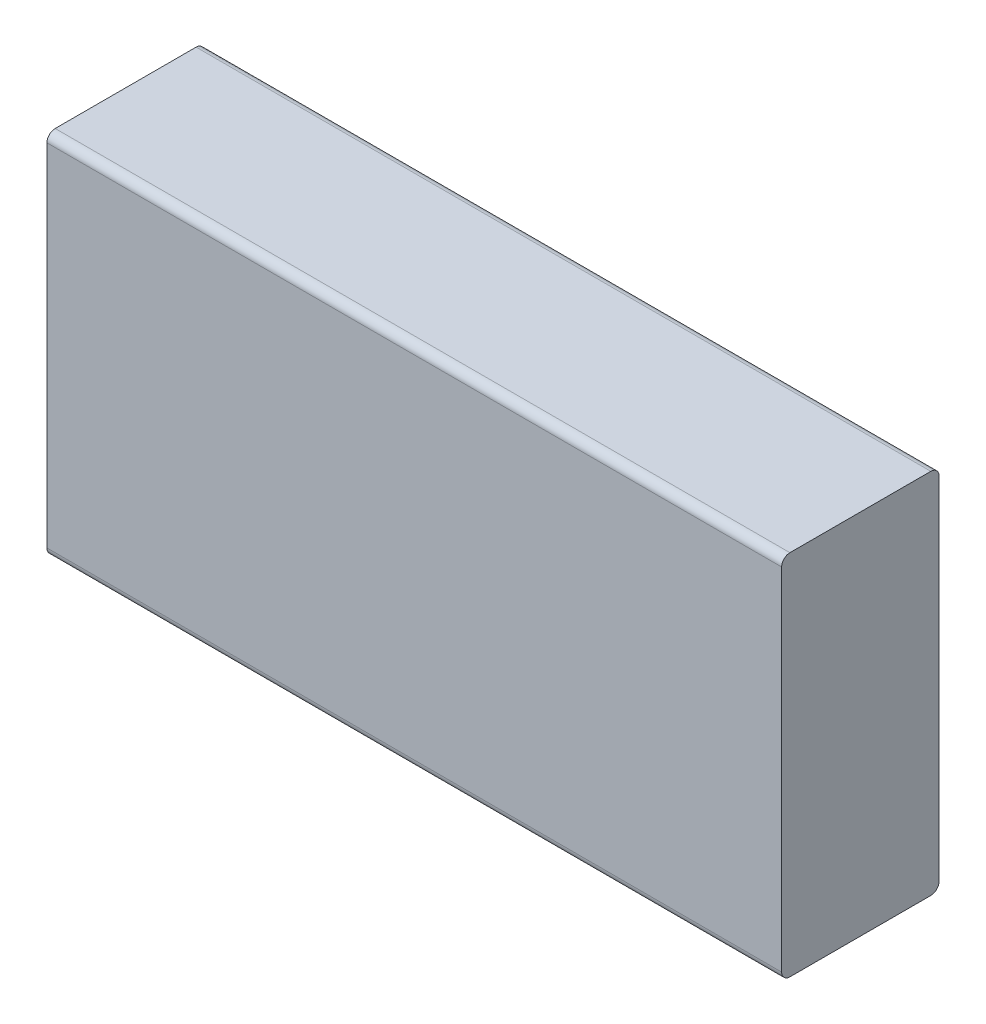
ISO-10303-21;
HEADER;
FILE_DESCRIPTION(('STEP AP214'),'2;1');
FILE_NAME('part.step','',(''),(''),'','','');
FILE_SCHEMA(('AUTOMOTIVE_DESIGN { 1 0 10303 214 1 1 1 1 }'));
ENDSEC;
DATA;
#1=APPLICATION_CONTEXT('core data for automotive mechanical design processes');
#2=APPLICATION_PROTOCOL_DEFINITION('international standard','automotive_design',2000,#1);
#3=PRODUCT_CONTEXT('',#1,'mechanical');
#4=PRODUCT('Part','Part','',(#3));
#5=PRODUCT_RELATED_PRODUCT_CATEGORY('part','',(#4));
#6=PRODUCT_DEFINITION_FORMATION('','',#4);
#7=PRODUCT_DEFINITION_CONTEXT('part definition',#1,'design');
#8=PRODUCT_DEFINITION('design','',#6,#7);
#9=PRODUCT_DEFINITION_SHAPE('','',#8);
#10=(LENGTH_UNIT() NAMED_UNIT(*) SI_UNIT(.MILLI.,.METRE.));
#11=(NAMED_UNIT(*) PLANE_ANGLE_UNIT() SI_UNIT($,.RADIAN.));
#12=(NAMED_UNIT(*) SI_UNIT($,.STERADIAN.) SOLID_ANGLE_UNIT());
#13=UNCERTAINTY_MEASURE_WITH_UNIT(LENGTH_MEASURE(1.E-05),#10,'distance_accuracy_value','');
#14=(GEOMETRIC_REPRESENTATION_CONTEXT(3) GLOBAL_UNCERTAINTY_ASSIGNED_CONTEXT((#13)) GLOBAL_UNIT_ASSIGNED_CONTEXT((#10,
#11,#12)) REPRESENTATION_CONTEXT('',''));
#15=CARTESIAN_POINT('',(0.,0.,0.));
#16=DIRECTION('',(0.,0.,1.));
#17=DIRECTION('',(1.,0.,0.));
#18=AXIS2_PLACEMENT_3D('',#15,#16,#17);
#19=CARTESIAN_POINT('',(177.8,-44.45,19.05));
#20=DIRECTION('',(0.,1.,0.));
#21=DIRECTION('',(0.,0.,1.));
#22=AXIS2_PLACEMENT_3D('',#19,#20,#21);
#23=PLANE('',#22);
#24=DIRECTION('',(0.,0.,-1.));
#25=VECTOR('',#24,1.);
#26=CARTESIAN_POINT('',(0.,-44.45,19.05));
#27=LINE('',#26,#25);
#28=CARTESIAN_POINT('',(0.,-44.45,17.05));
#29=VERTEX_POINT('',#28);
#30=CARTESIAN_POINT('',(0.,-44.45,-17.05));
#31=VERTEX_POINT('',#30);
#32=EDGE_CURVE('E127',#29,#31,#27,.T.);
#33=ORIENTED_EDGE('',*,*,#32,.T.);
#34=DIRECTION('',(-1.,0.,0.));
#35=VECTOR('',#34,1.);
#36=CARTESIAN_POINT('',(177.8,-44.45,-17.05));
#37=LINE('',#36,#35);
#38=CARTESIAN_POINT('',(177.8,-44.45,-17.05));
#39=VERTEX_POINT('',#38);
#40=EDGE_CURVE('E150',#31,#39,#37,.F.);
#41=ORIENTED_EDGE('',*,*,#40,.T.);
#42=DIRECTION('',(0.,0.,-1.));
#43=VECTOR('',#42,1.);
#44=CARTESIAN_POINT('',(177.8,-44.45,19.05));
#45=LINE('',#44,#43);
#46=CARTESIAN_POINT('',(177.8,-44.45,17.05));
#47=VERTEX_POINT('',#46);
#48=EDGE_CURVE('E125',#47,#39,#45,.T.);
#49=ORIENTED_EDGE('',*,*,#48,.F.);
#50=DIRECTION('',(-1.,0.,0.));
#51=VECTOR('',#50,1.);
#52=CARTESIAN_POINT('',(177.8,-44.45,17.05));
#53=LINE('',#52,#51);
#54=EDGE_CURVE('E147',#47,#29,#53,.T.);
#55=ORIENTED_EDGE('',*,*,#54,.T.);
#56=EDGE_LOOP('',(#33,#41,#49,#55));
#57=FACE_BOUND('',#56,.T.);
#58=ADVANCED_FACE('F32',(#57),#23,.F.);
#59=CARTESIAN_POINT('',(177.8,44.45,-19.05));
#60=DIRECTION('',(0.,0.,1.));
#61=DIRECTION('',(1.,0.,0.));
#62=AXIS2_PLACEMENT_3D('',#59,#60,#61);
#63=PLANE('',#62);
#64=DIRECTION('',(0.,1.,0.));
#65=VECTOR('',#64,1.);
#66=CARTESIAN_POINT('',(0.,44.45,-19.05));
#67=LINE('',#66,#65);
#68=CARTESIAN_POINT('',(0.,-42.45,-19.05));
#69=VERTEX_POINT('',#68);
#70=CARTESIAN_POINT('',(0.,42.45,-19.05));
#71=VERTEX_POINT('',#70);
#72=EDGE_CURVE('E123',#69,#71,#67,.T.);
#73=ORIENTED_EDGE('',*,*,#72,.T.);
#74=DIRECTION('',(-1.,0.,0.));
#75=VECTOR('',#74,1.);
#76=CARTESIAN_POINT('',(177.8,42.45,-19.05));
#77=LINE('',#76,#75);
#78=CARTESIAN_POINT('',(177.8,42.45,-19.05));
#79=VERTEX_POINT('',#78);
#80=EDGE_CURVE('E102',#71,#79,#77,.F.);
#81=ORIENTED_EDGE('',*,*,#80,.T.);
#82=DIRECTION('',(0.,1.,0.));
#83=VECTOR('',#82,1.);
#84=CARTESIAN_POINT('',(177.8,44.45,-19.05));
#85=LINE('',#84,#83);
#86=CARTESIAN_POINT('',(177.8,-42.45,-19.05));
#87=VERTEX_POINT('',#86);
#88=EDGE_CURVE('E166',#87,#79,#85,.T.);
#89=ORIENTED_EDGE('',*,*,#88,.F.);
#90=DIRECTION('',(-1.,0.,0.));
#91=VECTOR('',#90,1.);
#92=CARTESIAN_POINT('',(177.8,-42.45,-19.05));
#93=LINE('',#92,#91);
#94=EDGE_CURVE('E107',#87,#69,#93,.T.);
#95=ORIENTED_EDGE('',*,*,#94,.T.);
#96=EDGE_LOOP('',(#73,#81,#89,#95));
#97=FACE_BOUND('',#96,.T.);
#98=ADVANCED_FACE('F183',(#97),#63,.F.);
#99=CARTESIAN_POINT('',(177.8,44.45,19.05));
#100=DIRECTION('',(0.,-1.,0.));
#101=DIRECTION('',(0.,0.,-1.));
#102=AXIS2_PLACEMENT_3D('',#99,#100,#101);
#103=PLANE('',#102);
#104=DIRECTION('',(0.,0.,1.));
#105=VECTOR('',#104,1.);
#106=CARTESIAN_POINT('',(177.8,44.45,19.05));
#107=LINE('',#106,#105);
#108=CARTESIAN_POINT('',(177.8,44.45,-17.05));
#109=VERTEX_POINT('',#108);
#110=CARTESIAN_POINT('',(177.8,44.45,17.05));
#111=VERTEX_POINT('',#110);
#112=EDGE_CURVE('E116',#109,#111,#107,.T.);
#113=ORIENTED_EDGE('',*,*,#112,.F.);
#114=DIRECTION('',(-1.,0.,0.));
#115=VECTOR('',#114,1.);
#116=CARTESIAN_POINT('',(177.8,44.45,-17.05));
#117=LINE('',#116,#115);
#118=CARTESIAN_POINT('',(0.,44.45,-17.05));
#119=VERTEX_POINT('',#118);
#120=EDGE_CURVE('E101',#109,#119,#117,.T.);
#121=ORIENTED_EDGE('',*,*,#120,.T.);
#122=DIRECTION('',(0.,0.,1.));
#123=VECTOR('',#122,1.);
#124=CARTESIAN_POINT('',(0.,44.45,19.05));
#125=LINE('',#124,#123);
#126=CARTESIAN_POINT('',(0.,44.45,17.05));
#127=VERTEX_POINT('',#126);
#128=EDGE_CURVE('E114',#119,#127,#125,.T.);
#129=ORIENTED_EDGE('',*,*,#128,.T.);
#130=DIRECTION('',(-1.,0.,0.));
#131=VECTOR('',#130,1.);
#132=CARTESIAN_POINT('',(177.8,44.45,17.05));
#133=LINE('',#132,#131);
#134=EDGE_CURVE('E118',#127,#111,#133,.F.);
#135=ORIENTED_EDGE('',*,*,#134,.T.);
#136=EDGE_LOOP('',(#113,#121,#129,#135));
#137=FACE_BOUND('',#136,.T.);
#138=ADVANCED_FACE('F113',(#137),#103,.F.);
#139=CARTESIAN_POINT('',(177.8,44.45,19.05));
#140=DIRECTION('',(0.,0.,-1.));
#141=DIRECTION('',(-1.,0.,0.));
#142=AXIS2_PLACEMENT_3D('',#139,#140,#141);
#143=PLANE('',#142);
#144=DIRECTION('',(0.,-1.,0.));
#145=VECTOR('',#144,1.);
#146=CARTESIAN_POINT('',(0.,44.45,19.05));
#147=LINE('',#146,#145);
#148=CARTESIAN_POINT('',(0.,42.45,19.05));
#149=VERTEX_POINT('',#148);
#150=CARTESIAN_POINT('',(0.,-42.45,19.05));
#151=VERTEX_POINT('',#150);
#152=EDGE_CURVE('E122',#149,#151,#147,.T.);
#153=ORIENTED_EDGE('',*,*,#152,.T.);
#154=DIRECTION('',(-1.,0.,0.));
#155=VECTOR('',#154,1.);
#156=CARTESIAN_POINT('',(177.8,-42.45,19.05));
#157=LINE('',#156,#155);
#158=CARTESIAN_POINT('',(177.8,-42.45,19.05));
#159=VERTEX_POINT('',#158);
#160=EDGE_CURVE('E11',#151,#159,#157,.F.);
#161=ORIENTED_EDGE('',*,*,#160,.T.);
#162=DIRECTION('',(0.,-1.,0.));
#163=VECTOR('',#162,1.);
#164=CARTESIAN_POINT('',(177.8,44.45,19.05));
#165=LINE('',#164,#163);
#166=CARTESIAN_POINT('',(177.8,42.45,19.05));
#167=VERTEX_POINT('',#166);
#168=EDGE_CURVE('E131',#167,#159,#165,.T.);
#169=ORIENTED_EDGE('',*,*,#168,.F.);
#170=DIRECTION('',(-1.,0.,0.));
#171=VECTOR('',#170,1.);
#172=CARTESIAN_POINT('',(177.8,42.45,19.05));
#173=LINE('',#172,#171);
#174=EDGE_CURVE('E40',#167,#149,#173,.T.);
#175=ORIENTED_EDGE('',*,*,#174,.T.);
#176=EDGE_LOOP('',(#153,#161,#169,#175));
#177=FACE_BOUND('',#176,.T.);
#178=ADVANCED_FACE('F153',(#177),#143,.F.);
#179=CARTESIAN_POINT('',(177.8,0.,0.));
#180=DIRECTION('',(-1.,0.,0.));
#181=DIRECTION('',(0.,0.,1.));
#182=AXIS2_PLACEMENT_3D('',#179,#180,#181);
#183=PLANE('',#182);
#184=ORIENTED_EDGE('',*,*,#88,.T.);
#185=CARTESIAN_POINT('',(177.8,42.45,-17.05));
#186=DIRECTION('',(-1.,0.,0.));
#187=DIRECTION('',(0.,0.,1.));
#188=AXIS2_PLACEMENT_3D('',#185,#186,#187);
#189=CIRCLE('',#188,2.);
#190=EDGE_CURVE('E145',#79,#109,#189,.F.);
#191=ORIENTED_EDGE('',*,*,#190,.T.);
#192=ORIENTED_EDGE('',*,*,#112,.T.);
#193=CARTESIAN_POINT('',(177.8,42.45,17.05));
#194=DIRECTION('',(-1.,0.,0.));
#195=DIRECTION('',(0.,0.,1.));
#196=AXIS2_PLACEMENT_3D('',#193,#194,#195);
#197=CIRCLE('',#196,2.);
#198=EDGE_CURVE('E52',#111,#167,#197,.F.);
#199=ORIENTED_EDGE('',*,*,#198,.T.);
#200=ORIENTED_EDGE('',*,*,#168,.T.);
#201=CARTESIAN_POINT('',(177.8,-42.45,17.05));
#202=DIRECTION('',(-1.,0.,0.));
#203=DIRECTION('',(0.,0.,1.));
#204=AXIS2_PLACEMENT_3D('',#201,#202,#203);
#205=CIRCLE('',#204,2.);
#206=EDGE_CURVE('E141',#159,#47,#205,.F.);
#207=ORIENTED_EDGE('',*,*,#206,.T.);
#208=ORIENTED_EDGE('',*,*,#48,.T.);
#209=CARTESIAN_POINT('',(177.8,-42.45,-17.05));
#210=DIRECTION('',(-1.,0.,0.));
#211=DIRECTION('',(0.,0.,1.));
#212=AXIS2_PLACEMENT_3D('',#209,#210,#211);
#213=CIRCLE('',#212,2.);
#214=EDGE_CURVE('E143',#39,#87,#213,.F.);
#215=ORIENTED_EDGE('',*,*,#214,.T.);
#216=EDGE_LOOP('',(#184,#191,#192,#199,#200,#207,#208,#215));
#217=FACE_BOUND('',#216,.T.);
#218=ADVANCED_FACE('F172',(#217),#183,.F.);
#219=CARTESIAN_POINT('',(0.,0.,0.));
#220=DIRECTION('',(-1.,0.,0.));
#221=DIRECTION('',(0.,0.,1.));
#222=AXIS2_PLACEMENT_3D('',#219,#220,#221);
#223=PLANE('',#222);
#224=ORIENTED_EDGE('',*,*,#128,.F.);
#225=CARTESIAN_POINT('',(0.,42.45,-17.05));
#226=DIRECTION('',(-1.,0.,0.));
#227=DIRECTION('',(0.,0.,1.));
#228=AXIS2_PLACEMENT_3D('',#225,#226,#227);
#229=CIRCLE('',#228,2.);
#230=EDGE_CURVE('E97',#119,#71,#229,.T.);
#231=ORIENTED_EDGE('',*,*,#230,.T.);
#232=ORIENTED_EDGE('',*,*,#72,.F.);
#233=CARTESIAN_POINT('',(0.,-42.45,-17.05));
#234=DIRECTION('',(-1.,0.,0.));
#235=DIRECTION('',(0.,0.,1.));
#236=AXIS2_PLACEMENT_3D('',#233,#234,#235);
#237=CIRCLE('',#236,2.);
#238=EDGE_CURVE('E108',#69,#31,#237,.T.);
#239=ORIENTED_EDGE('',*,*,#238,.T.);
#240=ORIENTED_EDGE('',*,*,#32,.F.);
#241=CARTESIAN_POINT('',(0.,-42.45,17.05));
#242=DIRECTION('',(-1.,0.,0.));
#243=DIRECTION('',(0.,0.,1.));
#244=AXIS2_PLACEMENT_3D('',#241,#242,#243);
#245=CIRCLE('',#244,2.);
#246=EDGE_CURVE('E134',#29,#151,#245,.T.);
#247=ORIENTED_EDGE('',*,*,#246,.T.);
#248=ORIENTED_EDGE('',*,*,#152,.F.);
#249=CARTESIAN_POINT('',(0.,42.45,17.05));
#250=DIRECTION('',(-1.,0.,0.));
#251=DIRECTION('',(0.,0.,1.));
#252=AXIS2_PLACEMENT_3D('',#249,#250,#251);
#253=CIRCLE('',#252,2.);
#254=EDGE_CURVE('E117',#149,#127,#253,.T.);
#255=ORIENTED_EDGE('',*,*,#254,.T.);
#256=EDGE_LOOP('',(#224,#231,#232,#239,#240,#247,#248,#255));
#257=FACE_BOUND('',#256,.T.);
#258=ADVANCED_FACE('F120',(#257),#223,.T.);
#259=CARTESIAN_POINT('',(177.8,42.45,-17.05));
#260=DIRECTION('',(-1.,0.,0.));
#261=DIRECTION('',(0.,0.,1.));
#262=AXIS2_PLACEMENT_3D('',#259,#260,#261);
#263=CYLINDRICAL_SURFACE('',#262,2.);
#264=ORIENTED_EDGE('',*,*,#190,.F.);
#265=ORIENTED_EDGE('',*,*,#80,.F.);
#266=ORIENTED_EDGE('',*,*,#230,.F.);
#267=ORIENTED_EDGE('',*,*,#120,.F.);
#268=EDGE_LOOP('',(#264,#265,#266,#267));
#269=FACE_BOUND('',#268,.T.);
#270=ADVANCED_FACE('F100',(#269),#263,.T.);
#271=CARTESIAN_POINT('',(177.8,-42.45,-17.05));
#272=DIRECTION('',(-1.,0.,0.));
#273=DIRECTION('',(0.,0.,1.));
#274=AXIS2_PLACEMENT_3D('',#271,#272,#273);
#275=CYLINDRICAL_SURFACE('',#274,2.);
#276=ORIENTED_EDGE('',*,*,#214,.F.);
#277=ORIENTED_EDGE('',*,*,#40,.F.);
#278=ORIENTED_EDGE('',*,*,#238,.F.);
#279=ORIENTED_EDGE('',*,*,#94,.F.);
#280=EDGE_LOOP('',(#276,#277,#278,#279));
#281=FACE_BOUND('',#280,.T.);
#282=ADVANCED_FACE('F194',(#281),#275,.T.);
#283=CARTESIAN_POINT('',(177.8,-42.45,17.05));
#284=DIRECTION('',(-1.,0.,0.));
#285=DIRECTION('',(0.,0.,1.));
#286=AXIS2_PLACEMENT_3D('',#283,#284,#285);
#287=CYLINDRICAL_SURFACE('',#286,2.);
#288=ORIENTED_EDGE('',*,*,#206,.F.);
#289=ORIENTED_EDGE('',*,*,#160,.F.);
#290=ORIENTED_EDGE('',*,*,#246,.F.);
#291=ORIENTED_EDGE('',*,*,#54,.F.);
#292=EDGE_LOOP('',(#288,#289,#290,#291));
#293=FACE_BOUND('',#292,.T.);
#294=ADVANCED_FACE('F160',(#293),#287,.T.);
#295=CARTESIAN_POINT('',(177.8,42.45,17.05));
#296=DIRECTION('',(-1.,0.,0.));
#297=DIRECTION('',(0.,0.,1.));
#298=AXIS2_PLACEMENT_3D('',#295,#296,#297);
#299=CYLINDRICAL_SURFACE('',#298,2.);
#300=ORIENTED_EDGE('',*,*,#198,.F.);
#301=ORIENTED_EDGE('',*,*,#134,.F.);
#302=ORIENTED_EDGE('',*,*,#254,.F.);
#303=ORIENTED_EDGE('',*,*,#174,.F.);
#304=EDGE_LOOP('',(#300,#301,#302,#303));
#305=FACE_BOUND('',#304,.T.);
#306=ADVANCED_FACE('F34',(#305),#299,.T.);
#307=CLOSED_SHELL('',(#58,#98,#138,#178,#218,#258,#270,#282,#294,#306));
#308=MANIFOLD_SOLID_BREP('B2',#307);
#309=ADVANCED_BREP_SHAPE_REPRESENTATION('',(#18,#308),#14);
#310=SHAPE_DEFINITION_REPRESENTATION(#9,#309);
ENDSEC;
END-ISO-10303-21;
